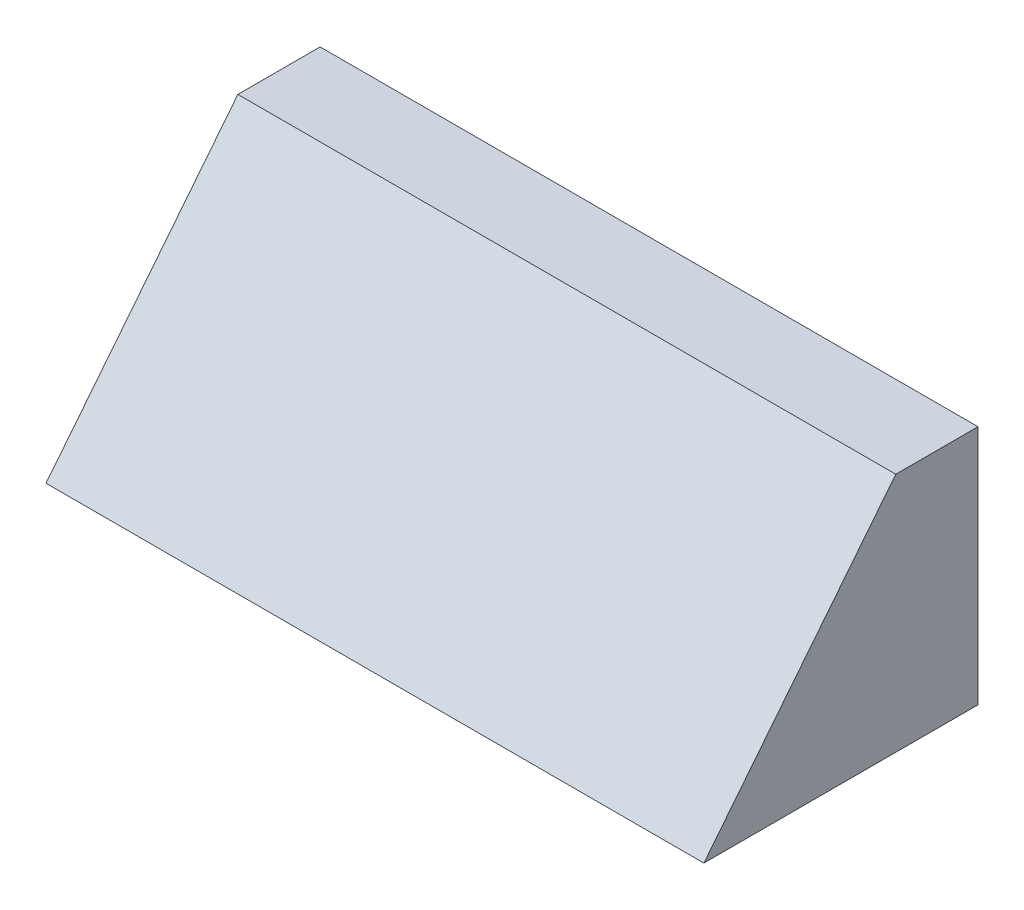
ISO-10303-21;
HEADER;
FILE_DESCRIPTION(('STEP AP214'),'2;1');
FILE_NAME('part.step','',(''),(''),'','','');
FILE_SCHEMA(('AUTOMOTIVE_DESIGN { 1 0 10303 214 1 1 1 1 }'));
ENDSEC;
DATA;
#1=APPLICATION_CONTEXT('core data for automotive mechanical design processes');
#2=APPLICATION_PROTOCOL_DEFINITION('international standard','automotive_design',2000,#1);
#3=PRODUCT_CONTEXT('',#1,'mechanical');
#4=PRODUCT('Part','Part','',(#3));
#5=PRODUCT_RELATED_PRODUCT_CATEGORY('part','',(#4));
#6=PRODUCT_DEFINITION_FORMATION('','',#4);
#7=PRODUCT_DEFINITION_CONTEXT('part definition',#1,'design');
#8=PRODUCT_DEFINITION('design','',#6,#7);
#9=PRODUCT_DEFINITION_SHAPE('','',#8);
#10=(LENGTH_UNIT() NAMED_UNIT(*) SI_UNIT(.MILLI.,.METRE.));
#11=(NAMED_UNIT(*) PLANE_ANGLE_UNIT() SI_UNIT($,.RADIAN.));
#12=(NAMED_UNIT(*) SI_UNIT($,.STERADIAN.) SOLID_ANGLE_UNIT());
#13=UNCERTAINTY_MEASURE_WITH_UNIT(LENGTH_MEASURE(1.E-05),#10,'distance_accuracy_value','');
#14=(GEOMETRIC_REPRESENTATION_CONTEXT(3) GLOBAL_UNCERTAINTY_ASSIGNED_CONTEXT((#13)) GLOBAL_UNIT_ASSIGNED_CONTEXT((#10,
#11,#12)) REPRESENTATION_CONTEXT('',''));
#15=CARTESIAN_POINT('',(0.,0.,0.));
#16=DIRECTION('',(0.,0.,1.));
#17=DIRECTION('',(1.,0.,0.));
#18=AXIS2_PLACEMENT_3D('',#15,#16,#17);
#19=CARTESIAN_POINT('',(48.,-8.78571428571429,-10.));
#20=DIRECTION('',(0.,0.,1.));
#21=DIRECTION('',(1.,0.,0.));
#22=AXIS2_PLACEMENT_3D('',#19,#20,#21);
#23=PLANE('',#22);
#24=DIRECTION('',(0.,1.,0.));
#25=VECTOR('',#24,1.);
#26=CARTESIAN_POINT('',(0.,-8.78571428571429,-10.));
#27=LINE('',#26,#25);
#28=CARTESIAN_POINT('',(0.,-8.78571428571429,-10.));
#29=VERTEX_POINT('',#28);
#30=CARTESIAN_POINT('',(0.,8.78571428571429,-10.));
#31=VERTEX_POINT('',#30);
#32=EDGE_CURVE('E96',#29,#31,#27,.T.);
#33=ORIENTED_EDGE('',*,*,#32,.T.);
#34=DIRECTION('',(-1.,0.,0.));
#35=VECTOR('',#34,1.);
#36=CARTESIAN_POINT('',(48.,8.78571428571429,-10.));
#37=LINE('',#36,#35);
#38=CARTESIAN_POINT('',(48.,8.78571428571429,-10.));
#39=VERTEX_POINT('',#38);
#40=EDGE_CURVE('E11',#39,#31,#37,.T.);
#41=ORIENTED_EDGE('',*,*,#40,.F.);
#42=DIRECTION('',(0.,1.,0.));
#43=VECTOR('',#42,1.);
#44=CARTESIAN_POINT('',(48.,-8.78571428571429,-10.));
#45=LINE('',#44,#43);
#46=CARTESIAN_POINT('',(48.,-8.78571428571429,-10.));
#47=VERTEX_POINT('',#46);
#48=EDGE_CURVE('E84',#47,#39,#45,.T.);
#49=ORIENTED_EDGE('',*,*,#48,.F.);
#50=DIRECTION('',(-1.,0.,0.));
#51=VECTOR('',#50,1.);
#52=CARTESIAN_POINT('',(48.,-8.78571428571429,-10.));
#53=LINE('',#52,#51);
#54=EDGE_CURVE('E92',#47,#29,#53,.T.);
#55=ORIENTED_EDGE('',*,*,#54,.T.);
#56=EDGE_LOOP('',(#33,#41,#49,#55));
#57=FACE_BOUND('',#56,.T.);
#58=ADVANCED_FACE('F33',(#57),#23,.F.);
#59=CARTESIAN_POINT('',(48.,8.78571428571429,-10.));
#60=DIRECTION('',(0.,-1.,0.));
#61=DIRECTION('',(0.,0.,-1.));
#62=AXIS2_PLACEMENT_3D('',#59,#60,#61);
#63=PLANE('',#62);
#64=DIRECTION('',(0.,0.,1.));
#65=VECTOR('',#64,1.);
#66=CARTESIAN_POINT('',(0.,8.78571428571429,-10.));
#67=LINE('',#66,#65);
#68=CARTESIAN_POINT('',(0.,8.78571428571429,-4.));
#69=VERTEX_POINT('',#68);
#70=EDGE_CURVE('E88',#31,#69,#67,.T.);
#71=ORIENTED_EDGE('',*,*,#70,.T.);
#72=DIRECTION('',(-1.,0.,0.));
#73=VECTOR('',#72,1.);
#74=CARTESIAN_POINT('',(48.,8.78571428571429,-4.));
#75=LINE('',#74,#73);
#76=CARTESIAN_POINT('',(48.,8.78571428571429,-4.));
#77=VERTEX_POINT('',#76);
#78=EDGE_CURVE('E41',#77,#69,#75,.T.);
#79=ORIENTED_EDGE('',*,*,#78,.F.);
#80=DIRECTION('',(0.,0.,1.));
#81=VECTOR('',#80,1.);
#82=CARTESIAN_POINT('',(48.,8.78571428571429,-10.));
#83=LINE('',#82,#81);
#84=EDGE_CURVE('E79',#39,#77,#83,.T.);
#85=ORIENTED_EDGE('',*,*,#84,.F.);
#86=ORIENTED_EDGE('',*,*,#40,.T.);
#87=EDGE_LOOP('',(#71,#79,#85,#86));
#88=FACE_BOUND('',#87,.T.);
#89=ADVANCED_FACE('F87',(#88),#63,.F.);
#90=CARTESIAN_POINT('',(48.,-8.7857142857143,10.));
#91=DIRECTION('',(0.,-0.62314293708751,-0.782107972058815));
#92=DIRECTION('',(0.,0.782107972058815,-0.62314293708751));
#93=AXIS2_PLACEMENT_3D('',#90,#91,#92);
#94=PLANE('',#93);
#95=DIRECTION('',(0.,-0.782107972058815,0.62314293708751));
#96=VECTOR('',#95,1.);
#97=CARTESIAN_POINT('',(0.,-8.7857142857143,10.));
#98=LINE('',#97,#96);
#99=CARTESIAN_POINT('',(0.,-8.7857142857143,10.));
#100=VERTEX_POINT('',#99);
#101=EDGE_CURVE('E66',#69,#100,#98,.T.);
#102=ORIENTED_EDGE('',*,*,#101,.T.);
#103=DIRECTION('',(-1.,0.,0.));
#104=VECTOR('',#103,1.);
#105=CARTESIAN_POINT('',(48.,-8.7857142857143,10.));
#106=LINE('',#105,#104);
#107=CARTESIAN_POINT('',(48.,-8.7857142857143,10.));
#108=VERTEX_POINT('',#107);
#109=EDGE_CURVE('E89',#108,#100,#106,.T.);
#110=ORIENTED_EDGE('',*,*,#109,.F.);
#111=DIRECTION('',(0.,-0.782107972058815,0.62314293708751));
#112=VECTOR('',#111,1.);
#113=CARTESIAN_POINT('',(48.,-8.7857142857143,10.));
#114=LINE('',#113,#112);
#115=EDGE_CURVE('E82',#77,#108,#114,.T.);
#116=ORIENTED_EDGE('',*,*,#115,.F.);
#117=ORIENTED_EDGE('',*,*,#78,.T.);
#118=EDGE_LOOP('',(#102,#110,#116,#117));
#119=FACE_BOUND('',#118,.T.);
#120=ADVANCED_FACE('F90',(#119),#94,.F.);
#121=CARTESIAN_POINT('',(48.,-8.7857142857143,10.));
#122=DIRECTION('',(0.,1.,0.));
#123=DIRECTION('',(0.,0.,1.));
#124=AXIS2_PLACEMENT_3D('',#121,#122,#123);
#125=PLANE('',#124);
#126=DIRECTION('',(0.,0.,-1.));
#127=VECTOR('',#126,1.);
#128=CARTESIAN_POINT('',(0.,-8.7857142857143,10.));
#129=LINE('',#128,#127);
#130=EDGE_CURVE('E72',#100,#29,#129,.T.);
#131=ORIENTED_EDGE('',*,*,#130,.T.);
#132=ORIENTED_EDGE('',*,*,#54,.F.);
#133=DIRECTION('',(0.,0.,-1.));
#134=VECTOR('',#133,1.);
#135=CARTESIAN_POINT('',(48.,-8.7857142857143,10.));
#136=LINE('',#135,#134);
#137=EDGE_CURVE('E49',#108,#47,#136,.T.);
#138=ORIENTED_EDGE('',*,*,#137,.F.);
#139=ORIENTED_EDGE('',*,*,#109,.T.);
#140=EDGE_LOOP('',(#131,#132,#138,#139));
#141=FACE_BOUND('',#140,.T.);
#142=ADVANCED_FACE('F103',(#141),#125,.F.);
#143=CARTESIAN_POINT('',(48.,0.,0.));
#144=DIRECTION('',(1.,0.,0.));
#145=DIRECTION('',(0.,0.,-1.));
#146=AXIS2_PLACEMENT_3D('',#143,#144,#145);
#147=PLANE('',#146);
#148=ORIENTED_EDGE('',*,*,#48,.T.);
#149=ORIENTED_EDGE('',*,*,#84,.T.);
#150=ORIENTED_EDGE('',*,*,#115,.T.);
#151=ORIENTED_EDGE('',*,*,#137,.T.);
#152=EDGE_LOOP('',(#148,#149,#150,#151));
#153=FACE_BOUND('',#152,.T.);
#154=ADVANCED_FACE('F80',(#153),#147,.T.);
#155=CARTESIAN_POINT('',(0.,0.,0.));
#156=DIRECTION('',(1.,0.,0.));
#157=DIRECTION('',(0.,0.,-1.));
#158=AXIS2_PLACEMENT_3D('',#155,#156,#157);
#159=PLANE('',#158);
#160=ORIENTED_EDGE('',*,*,#32,.F.);
#161=ORIENTED_EDGE('',*,*,#130,.F.);
#162=ORIENTED_EDGE('',*,*,#101,.F.);
#163=ORIENTED_EDGE('',*,*,#70,.F.);
#164=EDGE_LOOP('',(#160,#161,#162,#163));
#165=FACE_BOUND('',#164,.T.);
#166=ADVANCED_FACE('F106',(#165),#159,.F.);
#167=CLOSED_SHELL('',(#58,#89,#120,#142,#154,#166));
#168=MANIFOLD_SOLID_BREP('B2',#167);
#169=ADVANCED_BREP_SHAPE_REPRESENTATION('',(#18,#168),#14);
#170=SHAPE_DEFINITION_REPRESENTATION(#9,#169);
ENDSEC;
END-ISO-10303-21;
